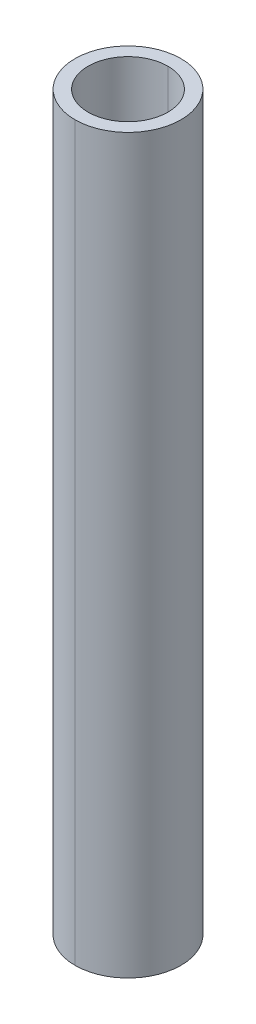
ISO-10303-21;
HEADER;
FILE_DESCRIPTION(('STEP AP214'),'2;1');
FILE_NAME('part.step','',(''),(''),'','','');
FILE_SCHEMA(('AUTOMOTIVE_DESIGN { 1 0 10303 214 1 1 1 1 }'));
ENDSEC;
DATA;
#1=APPLICATION_CONTEXT('core data for automotive mechanical design processes');
#2=APPLICATION_PROTOCOL_DEFINITION('international standard','automotive_design',2000,#1);
#3=PRODUCT_CONTEXT('',#1,'mechanical');
#4=PRODUCT('Part','Part','',(#3));
#5=PRODUCT_RELATED_PRODUCT_CATEGORY('part','',(#4));
#6=PRODUCT_DEFINITION_FORMATION('','',#4);
#7=PRODUCT_DEFINITION_CONTEXT('part definition',#1,'design');
#8=PRODUCT_DEFINITION('design','',#6,#7);
#9=PRODUCT_DEFINITION_SHAPE('','',#8);
#10=(LENGTH_UNIT() NAMED_UNIT(*) SI_UNIT(.MILLI.,.METRE.));
#11=(NAMED_UNIT(*) PLANE_ANGLE_UNIT() SI_UNIT($,.RADIAN.));
#12=(NAMED_UNIT(*) SI_UNIT($,.STERADIAN.) SOLID_ANGLE_UNIT());
#13=UNCERTAINTY_MEASURE_WITH_UNIT(LENGTH_MEASURE(1.E-05),#10,'distance_accuracy_value','');
#14=(GEOMETRIC_REPRESENTATION_CONTEXT(3) GLOBAL_UNCERTAINTY_ASSIGNED_CONTEXT((#13)) GLOBAL_UNIT_ASSIGNED_CONTEXT((#10,
#11,#12)) REPRESENTATION_CONTEXT('',''));
#15=CARTESIAN_POINT('',(0.,0.,0.));
#16=DIRECTION('',(0.,0.,1.));
#17=DIRECTION('',(1.,0.,0.));
#18=AXIS2_PLACEMENT_3D('',#15,#16,#17);
#19=CARTESIAN_POINT('',(0.,14.,0.));
#20=DIRECTION('',(0.,-1.,0.));
#21=DIRECTION('',(0.,0.,-1.));
#22=AXIS2_PLACEMENT_3D('',#19,#20,#21);
#23=CYLINDRICAL_SURFACE('',#22,1.525);
#24=CARTESIAN_POINT('',(0.,14.,0.));
#25=DIRECTION('',(0.,1.,0.));
#26=DIRECTION('',(0.,0.,1.));
#27=AXIS2_PLACEMENT_3D('',#24,#25,#26);
#28=CIRCLE('',#27,1.525);
#29=CARTESIAN_POINT('',(0.,14.,-1.525));
#30=VERTEX_POINT('',#29);
#31=CARTESIAN_POINT('',(0.,14.,1.525));
#32=VERTEX_POINT('',#31);
#33=EDGE_CURVE('E11',#30,#32,#28,.T.);
#34=ORIENTED_EDGE('',*,*,#33,.T.);
#35=DIRECTION('',(0.,-1.,0.));
#36=VECTOR('',#35,1.);
#37=CARTESIAN_POINT('',(0.,14.,1.525));
#38=LINE('',#37,#36);
#39=CARTESIAN_POINT('',(0.,-14.,1.525));
#40=VERTEX_POINT('',#39);
#41=EDGE_CURVE('E27',#32,#40,#38,.T.);
#42=ORIENTED_EDGE('',*,*,#41,.T.);
#43=CARTESIAN_POINT('',(0.,-14.,0.));
#44=DIRECTION('',(0.,1.,0.));
#45=DIRECTION('',(0.,0.,1.));
#46=AXIS2_PLACEMENT_3D('',#43,#44,#45);
#47=CIRCLE('',#46,1.525);
#48=CARTESIAN_POINT('',(0.,-14.,-1.525));
#49=VERTEX_POINT('',#48);
#50=EDGE_CURVE('E99',#49,#40,#47,.T.);
#51=ORIENTED_EDGE('',*,*,#50,.F.);
#52=DIRECTION('',(0.,-1.,0.));
#53=VECTOR('',#52,1.);
#54=CARTESIAN_POINT('',(0.,14.,-1.525));
#55=LINE('',#54,#53);
#56=EDGE_CURVE('E55',#30,#49,#55,.T.);
#57=ORIENTED_EDGE('',*,*,#56,.F.);
#58=EDGE_LOOP('',(#34,#42,#51,#57));
#59=FACE_BOUND('',#58,.T.);
#60=ADVANCED_FACE('F16',(#59),#23,.F.);
#61=CARTESIAN_POINT('',(0.,14.,0.));
#62=DIRECTION('',(0.,-1.,0.));
#63=DIRECTION('',(0.,0.,-1.));
#64=AXIS2_PLACEMENT_3D('',#61,#62,#63);
#65=CYLINDRICAL_SURFACE('',#64,2.025);
#66=CARTESIAN_POINT('',(0.,14.,0.));
#67=DIRECTION('',(0.,1.,0.));
#68=DIRECTION('',(0.,0.,1.));
#69=AXIS2_PLACEMENT_3D('',#66,#67,#68);
#70=CIRCLE('',#69,2.025);
#71=CARTESIAN_POINT('',(0.,14.,2.025));
#72=VERTEX_POINT('',#71);
#73=CARTESIAN_POINT('',(0.,14.,-2.025));
#74=VERTEX_POINT('',#73);
#75=EDGE_CURVE('E70',#72,#74,#70,.T.);
#76=ORIENTED_EDGE('',*,*,#75,.F.);
#77=DIRECTION('',(0.,-1.,0.));
#78=VECTOR('',#77,1.);
#79=CARTESIAN_POINT('',(0.,14.,2.025));
#80=LINE('',#79,#78);
#81=CARTESIAN_POINT('',(0.,-14.,2.025));
#82=VERTEX_POINT('',#81);
#83=EDGE_CURVE('E102',#72,#82,#80,.T.);
#84=ORIENTED_EDGE('',*,*,#83,.T.);
#85=CARTESIAN_POINT('',(0.,-14.,0.));
#86=DIRECTION('',(0.,1.,0.));
#87=DIRECTION('',(0.,0.,1.));
#88=AXIS2_PLACEMENT_3D('',#85,#86,#87);
#89=CIRCLE('',#88,2.025);
#90=CARTESIAN_POINT('',(0.,-14.,-2.025));
#91=VERTEX_POINT('',#90);
#92=EDGE_CURVE('E89',#82,#91,#89,.T.);
#93=ORIENTED_EDGE('',*,*,#92,.T.);
#94=DIRECTION('',(0.,-1.,0.));
#95=VECTOR('',#94,1.);
#96=CARTESIAN_POINT('',(0.,14.,-2.025));
#97=LINE('',#96,#95);
#98=EDGE_CURVE('E83',#74,#91,#97,.T.);
#99=ORIENTED_EDGE('',*,*,#98,.F.);
#100=EDGE_LOOP('',(#76,#84,#93,#99));
#101=FACE_BOUND('',#100,.T.);
#102=ADVANCED_FACE('F88',(#101),#65,.T.);
#103=CARTESIAN_POINT('',(0.,14.,0.));
#104=DIRECTION('',(0.,1.,0.));
#105=DIRECTION('',(1.,0.,0.));
#106=AXIS2_PLACEMENT_3D('',#103,#104,#105);
#107=PLANE('',#106);
#108=CARTESIAN_POINT('',(0.,14.,0.));
#109=DIRECTION('',(0.,1.,0.));
#110=DIRECTION('',(0.,0.,1.));
#111=AXIS2_PLACEMENT_3D('',#108,#109,#110);
#112=CIRCLE('',#111,2.025);
#113=EDGE_CURVE('E97',#74,#72,#112,.T.);
#114=ORIENTED_EDGE('',*,*,#113,.T.);
#115=ORIENTED_EDGE('',*,*,#75,.T.);
#116=EDGE_LOOP('',(#114,#115));
#117=FACE_BOUND('',#116,.T.);
#118=ORIENTED_EDGE('',*,*,#33,.F.);
#119=CARTESIAN_POINT('',(0.,14.,0.));
#120=DIRECTION('',(0.,1.,0.));
#121=DIRECTION('',(0.,0.,1.));
#122=AXIS2_PLACEMENT_3D('',#119,#120,#121);
#123=CIRCLE('',#122,1.525);
#124=EDGE_CURVE('E113',#32,#30,#123,.T.);
#125=ORIENTED_EDGE('',*,*,#124,.F.);
#126=EDGE_LOOP('',(#118,#125));
#127=FACE_BOUND('',#126,.T.);
#128=ADVANCED_FACE('F18',(#117,#127),#107,.T.);
#129=CARTESIAN_POINT('',(0.,-14.,0.));
#130=DIRECTION('',(0.,1.,0.));
#131=DIRECTION('',(1.,0.,0.));
#132=AXIS2_PLACEMENT_3D('',#129,#130,#131);
#133=PLANE('',#132);
#134=CARTESIAN_POINT('',(0.,-14.,0.));
#135=DIRECTION('',(0.,1.,0.));
#136=DIRECTION('',(0.,0.,1.));
#137=AXIS2_PLACEMENT_3D('',#134,#135,#136);
#138=CIRCLE('',#137,2.025);
#139=EDGE_CURVE('E20',#91,#82,#138,.T.);
#140=ORIENTED_EDGE('',*,*,#139,.F.);
#141=ORIENTED_EDGE('',*,*,#92,.F.);
#142=EDGE_LOOP('',(#140,#141));
#143=FACE_BOUND('',#142,.T.);
#144=ORIENTED_EDGE('',*,*,#50,.T.);
#145=CARTESIAN_POINT('',(0.,-14.,0.));
#146=DIRECTION('',(0.,1.,0.));
#147=DIRECTION('',(0.,0.,1.));
#148=AXIS2_PLACEMENT_3D('',#145,#146,#147);
#149=CIRCLE('',#148,1.525);
#150=EDGE_CURVE('E92',#40,#49,#149,.T.);
#151=ORIENTED_EDGE('',*,*,#150,.T.);
#152=EDGE_LOOP('',(#144,#151));
#153=FACE_BOUND('',#152,.T.);
#154=ADVANCED_FACE('F183',(#143,#153),#133,.F.);
#155=CARTESIAN_POINT('',(0.,14.,0.));
#156=DIRECTION('',(0.,-1.,0.));
#157=DIRECTION('',(0.,0.,-1.));
#158=AXIS2_PLACEMENT_3D('',#155,#156,#157);
#159=CYLINDRICAL_SURFACE('',#158,2.025);
#160=ORIENTED_EDGE('',*,*,#83,.F.);
#161=ORIENTED_EDGE('',*,*,#113,.F.);
#162=ORIENTED_EDGE('',*,*,#98,.T.);
#163=ORIENTED_EDGE('',*,*,#139,.T.);
#164=EDGE_LOOP('',(#160,#161,#162,#163));
#165=FACE_BOUND('',#164,.T.);
#166=ADVANCED_FACE('F101',(#165),#159,.T.);
#167=CARTESIAN_POINT('',(0.,14.,0.));
#168=DIRECTION('',(0.,-1.,0.));
#169=DIRECTION('',(0.,0.,-1.));
#170=AXIS2_PLACEMENT_3D('',#167,#168,#169);
#171=CYLINDRICAL_SURFACE('',#170,1.525);
#172=ORIENTED_EDGE('',*,*,#41,.F.);
#173=ORIENTED_EDGE('',*,*,#124,.T.);
#174=ORIENTED_EDGE('',*,*,#56,.T.);
#175=ORIENTED_EDGE('',*,*,#150,.F.);
#176=EDGE_LOOP('',(#172,#173,#174,#175));
#177=FACE_BOUND('',#176,.T.);
#178=ADVANCED_FACE('F175',(#177),#171,.F.);
#179=CLOSED_SHELL('',(#60,#102,#128,#154,#166,#178));
#180=MANIFOLD_SOLID_BREP('B1',#179);
#181=ADVANCED_BREP_SHAPE_REPRESENTATION('',(#18,#180),#14);
#182=SHAPE_DEFINITION_REPRESENTATION(#9,#181);
ENDSEC;
END-ISO-10303-21;
